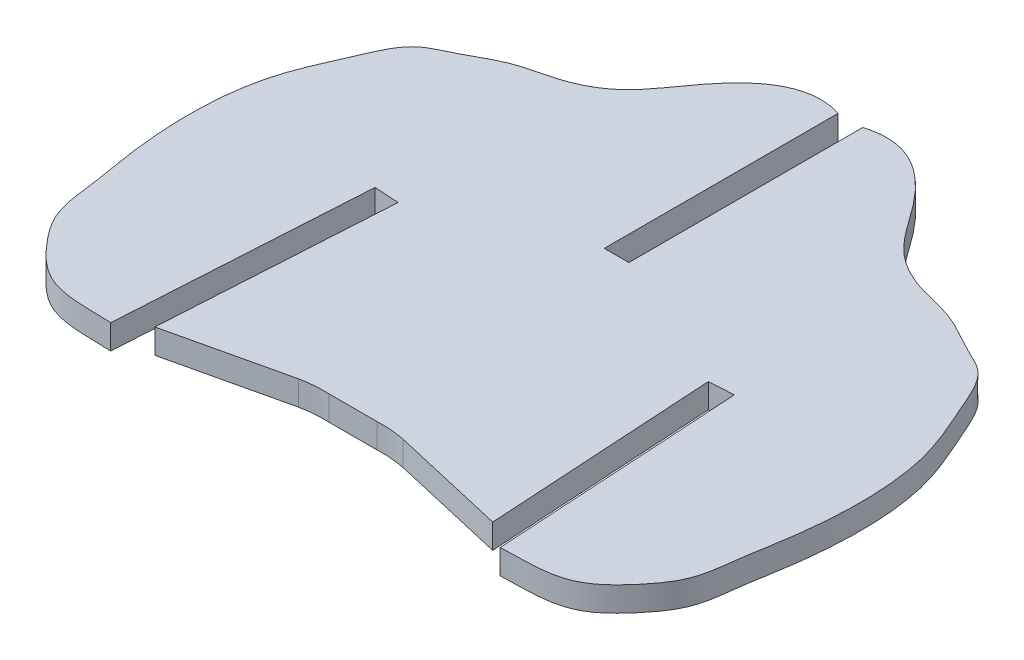
ISO-10303-21;
HEADER;
FILE_DESCRIPTION(('STEP AP214'),'2;1');
FILE_NAME('part.step','',(''),(''),'','','');
FILE_SCHEMA(('AUTOMOTIVE_DESIGN { 1 0 10303 214 1 1 1 1 }'));
ENDSEC;
DATA;
#1=APPLICATION_CONTEXT('core data for automotive mechanical design processes');
#2=APPLICATION_PROTOCOL_DEFINITION('international standard','automotive_design',2000,#1);
#3=PRODUCT_CONTEXT('',#1,'mechanical');
#4=PRODUCT('Part','Part','',(#3));
#5=PRODUCT_RELATED_PRODUCT_CATEGORY('part','',(#4));
#6=PRODUCT_DEFINITION_FORMATION('','',#4);
#7=PRODUCT_DEFINITION_CONTEXT('part definition',#1,'design');
#8=PRODUCT_DEFINITION('design','',#6,#7);
#9=PRODUCT_DEFINITION_SHAPE('','',#8);
#10=(LENGTH_UNIT() NAMED_UNIT(*) SI_UNIT(.MILLI.,.METRE.));
#11=(NAMED_UNIT(*) PLANE_ANGLE_UNIT() SI_UNIT($,.RADIAN.));
#12=(NAMED_UNIT(*) SI_UNIT($,.STERADIAN.) SOLID_ANGLE_UNIT());
#13=UNCERTAINTY_MEASURE_WITH_UNIT(LENGTH_MEASURE(1.E-05),#10,'distance_accuracy_value','');
#14=(GEOMETRIC_REPRESENTATION_CONTEXT(3) GLOBAL_UNCERTAINTY_ASSIGNED_CONTEXT((#13)) GLOBAL_UNIT_ASSIGNED_CONTEXT((#10,
#11,#12)) REPRESENTATION_CONTEXT('',''));
#15=CARTESIAN_POINT('',(0.,0.,0.));
#16=DIRECTION('',(0.,0.,1.));
#17=DIRECTION('',(1.,0.,0.));
#18=AXIS2_PLACEMENT_3D('',#15,#16,#17);
#19=CARTESIAN_POINT('',(322.506185163529,4.,-279.216996548922));
#20=CARTESIAN_POINT('',(315.784033325851,4.,-281.311766085583));
#21=CARTESIAN_POINT('',(308.229719217055,4.,-274.499419386254));
#22=CARTESIAN_POINT('',(302.327233956031,4.,-264.616389153382));
#23=CARTESIAN_POINT('',(295.405570696672,4.,-261.075530259062));
#24=CARTESIAN_POINT('',(288.57217539748,4.,-259.998183265288));
#25=CARTESIAN_POINT('',(283.597551311888,4.,-256.712650417958));
#26=CARTESIAN_POINT('',(277.74803247045,4.,-254.266266236053));
#27=CARTESIAN_POINT('',(274.862194463648,4.,-247.227227302913));
#28=CARTESIAN_POINT('',(270.865901955647,4.,-238.88630631199));
#29=CARTESIAN_POINT('',(269.340937728362,4.,-226.577719389289));
#30=CARTESIAN_POINT('',(270.315778530002,4.,-216.620970326966));
#31=CARTESIAN_POINT('',(271.95607082748,4.,-207.840217503691));
#32=CARTESIAN_POINT('',(272.304674706078,4.,-201.864992605412));
#33=CARTESIAN_POINT('',(276.509569600084,4.,-196.127844550806));
#34=CARTESIAN_POINT('',(281.140915827995,4.,-191.472787984609));
#35=CARTESIAN_POINT('',(287.393785872385,4.,-190.510159581782));
#36=CARTESIAN_POINT('',(291.147248056861,4.,-190.604513311933));
#37=CARTESIAN_POINT('',(292.815951682619,4.,-190.503683274104));
#38=B_SPLINE_CURVE_WITH_KNOTS('',3,(#19,#20,#21,#22,#23,#24,#25,#26,#27,#28,#29,#30,#31,#32,#33,
#34,#35,#36,#37),.UNSPECIFIED.,.F.,.F.,(4,1,1,1,1,1,1,1,1,1,1,1,1,1,1,1,4),(0.,0.13691507816526,
0.211026497905482,0.26049521129818,0.308388452991623,0.36733417055697,0.39572498038384,
0.44916700436731,0.529310598398589,0.610954998555693,0.727155915621704,0.756820743830885,
0.816073261631219,0.859025791607082,0.916880576523256,0.959528088785875,1.),.UNSPECIFIED.);
#39=DIRECTION('',(0.,-1.,0.));
#40=VECTOR('',#39,1.);
#41=SURFACE_OF_LINEAR_EXTRUSION('',#38,#40);
#42=CARTESIAN_POINT('',(322.506185163529,0.,-279.216996548922));
#43=CARTESIAN_POINT('',(315.784033325851,0.,-281.311766085583));
#44=CARTESIAN_POINT('',(308.229719217055,0.,-274.499419386254));
#45=CARTESIAN_POINT('',(302.327233956031,0.,-264.616389153382));
#46=CARTESIAN_POINT('',(295.405570696672,0.,-261.075530259062));
#47=CARTESIAN_POINT('',(288.57217539748,0.,-259.998183265288));
#48=CARTESIAN_POINT('',(283.597551311888,0.,-256.712650417958));
#49=CARTESIAN_POINT('',(277.74803247045,0.,-254.266266236053));
#50=CARTESIAN_POINT('',(274.862194463648,0.,-247.227227302913));
#51=CARTESIAN_POINT('',(270.865901955647,0.,-238.88630631199));
#52=CARTESIAN_POINT('',(269.340937728362,0.,-226.577719389289));
#53=CARTESIAN_POINT('',(270.315778530002,0.,-216.620970326966));
#54=CARTESIAN_POINT('',(271.95607082748,0.,-207.840217503691));
#55=CARTESIAN_POINT('',(272.304674706078,0.,-201.864992605412));
#56=CARTESIAN_POINT('',(276.509569600084,0.,-196.127844550806));
#57=CARTESIAN_POINT('',(281.140915827995,0.,-191.472787984609));
#58=CARTESIAN_POINT('',(287.393785872385,0.,-190.510159581782));
#59=CARTESIAN_POINT('',(291.147248056861,0.,-190.604513311933));
#60=CARTESIAN_POINT('',(292.815951682619,0.,-190.503683274104));
#61=B_SPLINE_CURVE_WITH_KNOTS('',3,(#42,#43,#44,#45,#46,#47,#48,#49,#50,#51,#52,#53,#54,#55,#56,
#57,#58,#59,#60),.UNSPECIFIED.,.F.,.F.,(4,1,1,1,1,1,1,1,1,1,1,1,1,1,1,1,4),(0.,0.13691507816526,
0.211026497905482,0.26049521129818,0.308388452991623,0.36733417055697,0.39572498038384,
0.44916700436731,0.529310598398589,0.610954998555693,0.727155915621704,0.756820743830885,
0.816073261631219,0.859025791607082,0.916880576523256,0.959528088785875,1.),.UNSPECIFIED.);
#62=CARTESIAN_POINT('',(322.506185163529,0.,-279.216996548922));
#63=VERTEX_POINT('',#62);
#64=CARTESIAN_POINT('',(292.815951682619,0.,-190.503683274104));
#65=VERTEX_POINT('',#64);
#66=EDGE_CURVE('E195',#63,#65,#61,.T.);
#67=ORIENTED_EDGE('',*,*,#66,.T.);
#68=DIRECTION('',(0.,-1.,0.));
#69=VECTOR('',#68,1.);
#70=CARTESIAN_POINT('',(292.815951682619,4.,-190.503683274104));
#71=LINE('',#70,#69);
#72=CARTESIAN_POINT('',(292.815951682619,4.,-190.503683274104));
#73=VERTEX_POINT('',#72);
#74=EDGE_CURVE('E11',#73,#65,#71,.T.);
#75=ORIENTED_EDGE('',*,*,#74,.F.);
#76=CARTESIAN_POINT('',(322.506185163529,4.,-279.216996548922));
#77=VERTEX_POINT('',#76);
#78=EDGE_CURVE('E284',#77,#73,#38,.T.);
#79=ORIENTED_EDGE('',*,*,#78,.F.);
#80=DIRECTION('',(0.,-1.,0.));
#81=VECTOR('',#80,1.);
#82=CARTESIAN_POINT('',(322.506185163529,4.,-279.216996548922));
#83=LINE('',#82,#81);
#84=EDGE_CURVE('E191',#77,#63,#83,.T.);
#85=ORIENTED_EDGE('',*,*,#84,.T.);
#86=EDGE_LOOP('',(#67,#75,#79,#85));
#87=FACE_BOUND('',#86,.T.);
#88=ADVANCED_FACE('F39',(#87),#41,.F.);
#89=CARTESIAN_POINT('',(292.815951682619,4.,-190.503683274104));
#90=DIRECTION('',(-0.998179443348504,0.,-0.0603141681238389));
#91=DIRECTION('',(-0.0603141681238389,0.,0.998179443348504));
#92=AXIS2_PLACEMENT_3D('',#89,#90,#91);
#93=PLANE('',#92);
#94=DIRECTION('',(0.0603141681238389,0.,-0.998179443348504));
#95=VECTOR('',#94,1.);
#96=CARTESIAN_POINT('',(292.815951682619,0.,-190.503683274104));
#97=LINE('',#96,#95);
#98=CARTESIAN_POINT('',(295.267574760643,0.,-231.077230675063));
#99=VERTEX_POINT('',#98);
#100=EDGE_CURVE('E201',#65,#99,#97,.T.);
#101=ORIENTED_EDGE('',*,*,#100,.T.);
#102=DIRECTION('',(0.,-1.,0.));
#103=VECTOR('',#102,1.);
#104=CARTESIAN_POINT('',(295.267574760643,4.,-231.077230675063));
#105=LINE('',#104,#103);
#106=CARTESIAN_POINT('',(295.267574760643,4.,-231.077230675063));
#107=VERTEX_POINT('',#106);
#108=EDGE_CURVE('E49',#107,#99,#105,.T.);
#109=ORIENTED_EDGE('',*,*,#108,.F.);
#110=DIRECTION('',(0.0603141681238389,0.,-0.998179443348504));
#111=VECTOR('',#110,1.);
#112=CARTESIAN_POINT('',(292.815951682619,4.,-190.503683274104));
#113=LINE('',#112,#111);
#114=EDGE_CURVE('E127',#73,#107,#113,.T.);
#115=ORIENTED_EDGE('',*,*,#114,.F.);
#116=ORIENTED_EDGE('',*,*,#74,.T.);
#117=EDGE_LOOP('',(#101,#109,#115,#116));
#118=FACE_BOUND('',#117,.T.);
#119=ADVANCED_FACE('F392',(#118),#93,.F.);
#120=CARTESIAN_POINT('',(295.267574760643,4.,-231.077230675063));
#121=DIRECTION('',(0.0603141681238404,0.,-0.998179443348504));
#122=DIRECTION('',(-0.998179443348504,0.,-0.0603141681238404));
#123=AXIS2_PLACEMENT_3D('',#120,#121,#122);
#124=PLANE('',#123);
#125=DIRECTION('',(0.998179443348504,0.,0.0603141681238404));
#126=VECTOR('',#125,1.);
#127=CARTESIAN_POINT('',(295.267574760643,0.,-231.077230675063));
#128=LINE('',#127,#126);
#129=CARTESIAN_POINT('',(299.260292534037,0.,-230.835974002568));
#130=VERTEX_POINT('',#129);
#131=EDGE_CURVE('E207',#99,#130,#128,.T.);
#132=ORIENTED_EDGE('',*,*,#131,.T.);
#133=DIRECTION('',(0.,-1.,0.));
#134=VECTOR('',#133,1.);
#135=CARTESIAN_POINT('',(299.260292534037,4.,-230.835974002568));
#136=LINE('',#135,#134);
#137=CARTESIAN_POINT('',(299.260292534037,4.,-230.835974002568));
#138=VERTEX_POINT('',#137);
#139=EDGE_CURVE('E327',#138,#130,#136,.T.);
#140=ORIENTED_EDGE('',*,*,#139,.F.);
#141=DIRECTION('',(0.998179443348504,0.,0.0603141681238404));
#142=VECTOR('',#141,1.);
#143=CARTESIAN_POINT('',(295.267574760643,4.,-231.077230675063));
#144=LINE('',#143,#142);
#145=EDGE_CURVE('E337',#107,#138,#144,.T.);
#146=ORIENTED_EDGE('',*,*,#145,.F.);
#147=ORIENTED_EDGE('',*,*,#108,.T.);
#148=EDGE_LOOP('',(#132,#140,#146,#147));
#149=FACE_BOUND('',#148,.T.);
#150=ADVANCED_FACE('F335',(#149),#124,.F.);
#151=CARTESIAN_POINT('',(299.260292534037,4.,-230.835974002568));
#152=DIRECTION('',(0.998179443348504,0.,0.0603141681238389));
#153=DIRECTION('',(0.0603141681238389,0.,-0.998179443348504));
#154=AXIS2_PLACEMENT_3D('',#151,#152,#153);
#155=PLANE('',#154);
#156=DIRECTION('',(-0.0603141681238389,0.,0.998179443348504));
#157=VECTOR('',#156,1.);
#158=CARTESIAN_POINT('',(299.260292534037,0.,-230.835974002568));
#159=LINE('',#158,#157);
#160=CARTESIAN_POINT('',(297.003479911162,0.,-193.48647490945));
#161=VERTEX_POINT('',#160);
#162=EDGE_CURVE('E210',#130,#161,#159,.T.);
#163=ORIENTED_EDGE('',*,*,#162,.T.);
#164=DIRECTION('',(0.,-1.,0.));
#165=VECTOR('',#164,1.);
#166=CARTESIAN_POINT('',(297.003479911162,4.,-193.48647490945));
#167=LINE('',#166,#165);
#168=CARTESIAN_POINT('',(297.003479911162,4.,-193.48647490945));
#169=VERTEX_POINT('',#168);
#170=EDGE_CURVE('E323',#169,#161,#167,.T.);
#171=ORIENTED_EDGE('',*,*,#170,.F.);
#172=DIRECTION('',(-0.0603141681238389,0.,0.998179443348504));
#173=VECTOR('',#172,1.);
#174=CARTESIAN_POINT('',(299.260292534037,4.,-230.835974002568));
#175=LINE('',#174,#173);
#176=EDGE_CURVE('E356',#138,#169,#175,.T.);
#177=ORIENTED_EDGE('',*,*,#176,.F.);
#178=ORIENTED_EDGE('',*,*,#139,.T.);
#179=EDGE_LOOP('',(#163,#171,#177,#178));
#180=FACE_BOUND('',#179,.T.);
#181=ADVANCED_FACE('F346',(#180),#155,.F.);
#182=CARTESIAN_POINT('',(297.003479911162,4.,-193.48647490945));
#183=DIRECTION('',(-0.224874405786858,0.,-0.974387757323545));
#184=DIRECTION('',(-0.974387757323545,0.,0.224874405786858));
#185=AXIS2_PLACEMENT_3D('',#182,#183,#184);
#186=PLANE('',#185);
#187=CARTESIAN_POINT('',(297.003479911162,0.,-193.48647490945));
#188=CARTESIAN_POINT('',(316.038590288234,0.,-197.879499250077));
#189=B_SPLINE_CURVE_WITH_KNOTS('',1,(#187,#188),.UNSPECIFIED.,.F.,.F.,(2,2),(0.,1.),.UNSPECIFIED.);
#190=CARTESIAN_POINT('',(316.038590288234,0.,-197.879499250077));
#191=VERTEX_POINT('',#190);
#192=EDGE_CURVE('E213',#161,#191,#189,.T.);
#193=ORIENTED_EDGE('',*,*,#192,.T.);
#194=DIRECTION('',(0.,-1.,0.));
#195=VECTOR('',#194,1.);
#196=CARTESIAN_POINT('',(316.038590288234,4.,-197.879499250077));
#197=LINE('',#196,#195);
#198=CARTESIAN_POINT('',(316.038590288234,4.,-197.879499250077));
#199=VERTEX_POINT('',#198);
#200=EDGE_CURVE('E319',#199,#191,#197,.T.);
#201=ORIENTED_EDGE('',*,*,#200,.F.);
#202=CARTESIAN_POINT('',(297.003479911162,4.,-193.48647490945));
#203=CARTESIAN_POINT('',(316.038590288234,4.,-197.879499250077));
#204=B_SPLINE_CURVE_WITH_KNOTS('',1,(#202,#203),.UNSPECIFIED.,.F.,.F.,(2,2),(0.,1.),.UNSPECIFIED.);
#205=EDGE_CURVE('E352',#169,#199,#204,.T.);
#206=ORIENTED_EDGE('',*,*,#205,.F.);
#207=ORIENTED_EDGE('',*,*,#170,.T.);
#208=EDGE_LOOP('',(#193,#201,#206,#207));
#209=FACE_BOUND('',#208,.T.);
#210=ADVANCED_FACE('F350',(#209),#186,.F.);
#211=CARTESIAN_POINT('',(316.038590288234,4.,-197.879499250077));
#212=CARTESIAN_POINT('',(318.288866716262,4.,-198.328988408155));
#213=CARTESIAN_POINT('',(320.571669046707,4.,-198.235143432406));
#214=B_SPLINE_CURVE_WITH_KNOTS('',2,(#211,#212,#213),.UNSPECIFIED.,.F.,.F.,(3,3),(0.,1.),.UNSPECIFIED.);
#215=DIRECTION('',(0.,-1.,0.));
#216=VECTOR('',#215,1.);
#217=SURFACE_OF_LINEAR_EXTRUSION('',#214,#216);
#218=CARTESIAN_POINT('',(316.038590288234,0.,-197.879499250077));
#219=CARTESIAN_POINT('',(318.288866716262,0.,-198.328988408155));
#220=CARTESIAN_POINT('',(320.571669046707,0.,-198.235143432406));
#221=B_SPLINE_CURVE_WITH_KNOTS('',2,(#218,#219,#220),.UNSPECIFIED.,.F.,.F.,(3,3),(0.,1.),.UNSPECIFIED.);
#222=CARTESIAN_POINT('',(320.571669046707,0.,-198.235143432406));
#223=VERTEX_POINT('',#222);
#224=EDGE_CURVE('E218',#191,#223,#221,.T.);
#225=ORIENTED_EDGE('',*,*,#224,.T.);
#226=DIRECTION('',(0.,-1.,0.));
#227=VECTOR('',#226,1.);
#228=CARTESIAN_POINT('',(320.571669046707,4.,-198.235143432406));
#229=LINE('',#228,#227);
#230=CARTESIAN_POINT('',(320.571669046707,4.,-198.235143432406));
#231=VERTEX_POINT('',#230);
#232=EDGE_CURVE('E315',#231,#223,#229,.T.);
#233=ORIENTED_EDGE('',*,*,#232,.F.);
#234=EDGE_CURVE('E355',#199,#231,#214,.T.);
#235=ORIENTED_EDGE('',*,*,#234,.F.);
#236=ORIENTED_EDGE('',*,*,#200,.T.);
#237=EDGE_LOOP('',(#225,#233,#235,#236));
#238=FACE_BOUND('',#237,.T.);
#239=ADVANCED_FACE('F380',(#238),#217,.F.);
#240=CARTESIAN_POINT('',(324.506185163528,4.,-198.235143432406));
#241=DIRECTION('',(0.,0.,-1.));
#242=DIRECTION('',(-1.,0.,0.));
#243=AXIS2_PLACEMENT_3D('',#240,#241,#242);
#244=PLANE('',#243);
#245=CARTESIAN_POINT('',(324.506185163528,0.,-198.235143432406));
#246=CARTESIAN_POINT('',(328.44070128035,0.,-198.235143432406));
#247=B_SPLINE_CURVE_WITH_KNOTS('',1,(#245,#246),.UNSPECIFIED.,.F.,.F.,(2,2),(0.,1.),.UNSPECIFIED.);
#248=CARTESIAN_POINT('',(324.506185163528,0.,-198.235143432406));
#249=VERTEX_POINT('',#248);
#250=CARTESIAN_POINT('',(328.44070128035,0.,-198.235143432406));
#251=VERTEX_POINT('',#250);
#252=EDGE_CURVE('E234',#249,#251,#247,.T.);
#253=ORIENTED_EDGE('',*,*,#252,.T.);
#254=DIRECTION('',(0.,-1.,0.));
#255=VECTOR('',#254,1.);
#256=CARTESIAN_POINT('',(328.44070128035,4.,-198.235143432406));
#257=LINE('',#256,#255);
#258=CARTESIAN_POINT('',(328.44070128035,4.,-198.235143432406));
#259=VERTEX_POINT('',#258);
#260=EDGE_CURVE('E311',#259,#251,#257,.T.);
#261=ORIENTED_EDGE('',*,*,#260,.F.);
#262=CARTESIAN_POINT('',(324.506185163528,4.,-198.235143432406));
#263=CARTESIAN_POINT('',(328.44070128035,4.,-198.235143432406));
#264=B_SPLINE_CURVE_WITH_KNOTS('',1,(#262,#263),.UNSPECIFIED.,.F.,.F.,(2,2),(0.,1.),.UNSPECIFIED.);
#265=CARTESIAN_POINT('',(324.506185163528,4.,-198.235143432406));
#266=VERTEX_POINT('',#265);
#267=EDGE_CURVE('E440',#266,#259,#264,.T.);
#268=ORIENTED_EDGE('',*,*,#267,.F.);
#269=CARTESIAN_POINT('',(320.571669046707,4.,-198.235143432406));
#270=CARTESIAN_POINT('',(324.506185163528,4.,-198.235143432406));
#271=B_SPLINE_CURVE_WITH_KNOTS('',1,(#269,#270),.UNSPECIFIED.,.F.,.F.,(2,2),(0.,1.),.UNSPECIFIED.);
#272=EDGE_CURVE('E360',#231,#266,#271,.T.);
#273=ORIENTED_EDGE('',*,*,#272,.F.);
#274=ORIENTED_EDGE('',*,*,#232,.T.);
#275=CARTESIAN_POINT('',(320.571669046707,0.,-198.235143432406));
#276=CARTESIAN_POINT('',(324.506185163528,0.,-198.235143432406));
#277=B_SPLINE_CURVE_WITH_KNOTS('',1,(#275,#276),.UNSPECIFIED.,.F.,.F.,(2,2),(0.,1.),.UNSPECIFIED.);
#278=EDGE_CURVE('E226',#223,#249,#277,.T.);
#279=ORIENTED_EDGE('',*,*,#278,.T.);
#280=EDGE_LOOP('',(#253,#261,#268,#273,#274,#279));
#281=FACE_BOUND('',#280,.T.);
#282=ADVANCED_FACE('F384',(#281),#244,.F.);
#283=CARTESIAN_POINT('',(328.44070128035,4.,-198.235143432406));
#284=CARTESIAN_POINT('',(330.723503610795,4.,-198.328988408155));
#285=CARTESIAN_POINT('',(332.973780038823,4.,-197.879499250077));
#286=B_SPLINE_CURVE_WITH_KNOTS('',2,(#283,#284,#285),.UNSPECIFIED.,.F.,.F.,(3,3),(0.,1.),.UNSPECIFIED.);
#287=DIRECTION('',(0.,-1.,0.));
#288=VECTOR('',#287,1.);
#289=SURFACE_OF_LINEAR_EXTRUSION('',#286,#288);
#290=CARTESIAN_POINT('',(328.44070128035,0.,-198.235143432406));
#291=CARTESIAN_POINT('',(330.723503610795,0.,-198.328988408155));
#292=CARTESIAN_POINT('',(332.973780038823,0.,-197.879499250077));
#293=B_SPLINE_CURVE_WITH_KNOTS('',2,(#290,#291,#292),.UNSPECIFIED.,.F.,.F.,(3,3),(0.,1.),.UNSPECIFIED.);
#294=CARTESIAN_POINT('',(332.973780038823,0.,-197.879499250077));
#295=VERTEX_POINT('',#294);
#296=EDGE_CURVE('E242',#251,#295,#293,.T.);
#297=ORIENTED_EDGE('',*,*,#296,.T.);
#298=DIRECTION('',(0.,-1.,0.));
#299=VECTOR('',#298,1.);
#300=CARTESIAN_POINT('',(332.973780038823,4.,-197.879499250077));
#301=LINE('',#300,#299);
#302=CARTESIAN_POINT('',(332.973780038823,4.,-197.879499250077));
#303=VERTEX_POINT('',#302);
#304=EDGE_CURVE('E307',#303,#295,#301,.T.);
#305=ORIENTED_EDGE('',*,*,#304,.F.);
#306=EDGE_CURVE('E432',#259,#303,#286,.T.);
#307=ORIENTED_EDGE('',*,*,#306,.F.);
#308=ORIENTED_EDGE('',*,*,#260,.T.);
#309=EDGE_LOOP('',(#297,#305,#307,#308));
#310=FACE_BOUND('',#309,.T.);
#311=ADVANCED_FACE('F431',(#310),#289,.F.);
#312=CARTESIAN_POINT('',(332.973780038823,4.,-197.879499250077));
#313=DIRECTION('',(0.224874405786858,0.,-0.974387757323545));
#314=DIRECTION('',(-0.974387757323545,0.,-0.224874405786858));
#315=AXIS2_PLACEMENT_3D('',#312,#313,#314);
#316=PLANE('',#315);
#317=CARTESIAN_POINT('',(332.973780038823,0.,-197.879499250077));
#318=CARTESIAN_POINT('',(352.008890415895,0.,-193.48647490945));
#319=B_SPLINE_CURVE_WITH_KNOTS('',1,(#317,#318),.UNSPECIFIED.,.F.,.F.,(2,2),(0.,1.),.UNSPECIFIED.);
#320=CARTESIAN_POINT('',(352.008890415895,0.,-193.48647490945));
#321=VERTEX_POINT('',#320);
#322=EDGE_CURVE('E250',#295,#321,#319,.T.);
#323=ORIENTED_EDGE('',*,*,#322,.T.);
#324=DIRECTION('',(0.,-1.,0.));
#325=VECTOR('',#324,1.);
#326=CARTESIAN_POINT('',(352.008890415895,4.,-193.48647490945));
#327=LINE('',#326,#325);
#328=CARTESIAN_POINT('',(352.008890415895,4.,-193.48647490945));
#329=VERTEX_POINT('',#328);
#330=EDGE_CURVE('E303',#329,#321,#327,.T.);
#331=ORIENTED_EDGE('',*,*,#330,.F.);
#332=CARTESIAN_POINT('',(332.973780038823,4.,-197.879499250077));
#333=CARTESIAN_POINT('',(352.008890415895,4.,-193.48647490945));
#334=B_SPLINE_CURVE_WITH_KNOTS('',1,(#332,#333),.UNSPECIFIED.,.F.,.F.,(2,2),(0.,1.),.UNSPECIFIED.);
#335=EDGE_CURVE('E427',#303,#329,#334,.T.);
#336=ORIENTED_EDGE('',*,*,#335,.F.);
#337=ORIENTED_EDGE('',*,*,#304,.T.);
#338=EDGE_LOOP('',(#323,#331,#336,#337));
#339=FACE_BOUND('',#338,.T.);
#340=ADVANCED_FACE('F426',(#339),#316,.F.);
#341=CARTESIAN_POINT('',(349.75207779302,4.,-230.835974002568));
#342=DIRECTION('',(-0.998179443348504,0.,0.0603141681238389));
#343=DIRECTION('',(0.0603141681238389,0.,0.998179443348504));
#344=AXIS2_PLACEMENT_3D('',#341,#342,#343);
#345=PLANE('',#344);
#346=DIRECTION('',(-0.0603141681238389,0.,-0.998179443348504));
#347=VECTOR('',#346,1.);
#348=CARTESIAN_POINT('',(349.75207779302,0.,-230.835974002568));
#349=LINE('',#348,#347);
#350=CARTESIAN_POINT('',(349.75207779302,0.,-230.835974002568));
#351=VERTEX_POINT('',#350);
#352=EDGE_CURVE('E258',#321,#351,#349,.T.);
#353=ORIENTED_EDGE('',*,*,#352,.T.);
#354=DIRECTION('',(0.,-1.,0.));
#355=VECTOR('',#354,1.);
#356=CARTESIAN_POINT('',(349.75207779302,4.,-230.835974002568));
#357=LINE('',#356,#355);
#358=CARTESIAN_POINT('',(349.75207779302,4.,-230.835974002568));
#359=VERTEX_POINT('',#358);
#360=EDGE_CURVE('E299',#359,#351,#357,.T.);
#361=ORIENTED_EDGE('',*,*,#360,.F.);
#362=DIRECTION('',(-0.0603141681238389,0.,-0.998179443348504));
#363=VECTOR('',#362,1.);
#364=CARTESIAN_POINT('',(349.75207779302,4.,-230.835974002568));
#365=LINE('',#364,#363);
#366=EDGE_CURVE('E423',#329,#359,#365,.T.);
#367=ORIENTED_EDGE('',*,*,#366,.F.);
#368=ORIENTED_EDGE('',*,*,#330,.T.);
#369=EDGE_LOOP('',(#353,#361,#367,#368));
#370=FACE_BOUND('',#369,.T.);
#371=ADVANCED_FACE('F420',(#370),#345,.F.);
#372=CARTESIAN_POINT('',(353.744795566414,4.,-231.077230675063));
#373=DIRECTION('',(-0.0603141681238404,0.,-0.998179443348504));
#374=DIRECTION('',(-0.998179443348504,0.,0.0603141681238404));
#375=AXIS2_PLACEMENT_3D('',#372,#373,#374);
#376=PLANE('',#375);
#377=DIRECTION('',(0.998179443348504,0.,-0.0603141681238404));
#378=VECTOR('',#377,1.);
#379=CARTESIAN_POINT('',(353.744795566414,0.,-231.077230675063));
#380=LINE('',#379,#378);
#381=CARTESIAN_POINT('',(353.744795566414,0.,-231.077230675063));
#382=VERTEX_POINT('',#381);
#383=EDGE_CURVE('E264',#351,#382,#380,.T.);
#384=ORIENTED_EDGE('',*,*,#383,.T.);
#385=DIRECTION('',(0.,-1.,0.));
#386=VECTOR('',#385,1.);
#387=CARTESIAN_POINT('',(353.744795566414,4.,-231.077230675063));
#388=LINE('',#387,#386);
#389=CARTESIAN_POINT('',(353.744795566414,4.,-231.077230675063));
#390=VERTEX_POINT('',#389);
#391=EDGE_CURVE('E295',#390,#382,#388,.T.);
#392=ORIENTED_EDGE('',*,*,#391,.F.);
#393=DIRECTION('',(0.998179443348504,0.,-0.0603141681238404));
#394=VECTOR('',#393,1.);
#395=CARTESIAN_POINT('',(353.744795566414,4.,-231.077230675063));
#396=LINE('',#395,#394);
#397=EDGE_CURVE('E414',#359,#390,#396,.T.);
#398=ORIENTED_EDGE('',*,*,#397,.F.);
#399=ORIENTED_EDGE('',*,*,#360,.T.);
#400=EDGE_LOOP('',(#384,#392,#398,#399));
#401=FACE_BOUND('',#400,.T.);
#402=ADVANCED_FACE('F413',(#401),#376,.F.);
#403=CARTESIAN_POINT('',(356.196418644438,4.,-190.503683274104));
#404=DIRECTION('',(0.998179443348504,0.,-0.0603141681238389));
#405=DIRECTION('',(-0.0603141681238389,0.,-0.998179443348504));
#406=AXIS2_PLACEMENT_3D('',#403,#404,#405);
#407=PLANE('',#406);
#408=DIRECTION('',(0.0603141681238389,0.,0.998179443348504));
#409=VECTOR('',#408,1.);
#410=CARTESIAN_POINT('',(356.196418644438,0.,-190.503683274104));
#411=LINE('',#410,#409);
#412=CARTESIAN_POINT('',(356.196418644438,0.,-190.503683274104));
#413=VERTEX_POINT('',#412);
#414=EDGE_CURVE('E267',#382,#413,#411,.T.);
#415=ORIENTED_EDGE('',*,*,#414,.T.);
#416=DIRECTION('',(0.,-1.,0.));
#417=VECTOR('',#416,1.);
#418=CARTESIAN_POINT('',(356.196418644438,4.,-190.503683274104));
#419=LINE('',#418,#417);
#420=CARTESIAN_POINT('',(356.196418644438,4.,-190.503683274104));
#421=VERTEX_POINT('',#420);
#422=EDGE_CURVE('E291',#421,#413,#419,.T.);
#423=ORIENTED_EDGE('',*,*,#422,.F.);
#424=DIRECTION('',(0.0603141681238389,0.,0.998179443348504));
#425=VECTOR('',#424,1.);
#426=CARTESIAN_POINT('',(356.196418644438,4.,-190.503683274104));
#427=LINE('',#426,#425);
#428=EDGE_CURVE('E409',#390,#421,#427,.T.);
#429=ORIENTED_EDGE('',*,*,#428,.F.);
#430=ORIENTED_EDGE('',*,*,#391,.T.);
#431=EDGE_LOOP('',(#415,#423,#429,#430));
#432=FACE_BOUND('',#431,.T.);
#433=ADVANCED_FACE('F408',(#432),#407,.F.);
#434=CARTESIAN_POINT('',(356.196418644438,4.,-190.503683274104));
#435=CARTESIAN_POINT('',(357.865122270196,4.,-190.604513311933));
#436=CARTESIAN_POINT('',(361.618584454671,4.,-190.510159581782));
#437=CARTESIAN_POINT('',(367.871454499062,4.,-191.472787984609));
#438=CARTESIAN_POINT('',(372.502800726973,4.,-196.127844550806));
#439=CARTESIAN_POINT('',(376.707695620979,4.,-201.864992605412));
#440=CARTESIAN_POINT('',(377.056299499577,4.,-207.840217503691));
#441=CARTESIAN_POINT('',(378.696591797055,4.,-216.620970326966));
#442=CARTESIAN_POINT('',(379.671432598695,4.,-226.577719389289));
#443=CARTESIAN_POINT('',(378.14646837141,4.,-238.88630631199));
#444=CARTESIAN_POINT('',(374.150175863409,4.,-247.227227302913));
#445=CARTESIAN_POINT('',(371.264337856607,4.,-254.266266236053));
#446=CARTESIAN_POINT('',(365.414819015168,4.,-256.712650417958));
#447=CARTESIAN_POINT('',(360.440194929577,4.,-259.998183265288));
#448=CARTESIAN_POINT('',(353.606799630385,4.,-261.075530259062));
#449=CARTESIAN_POINT('',(346.685136371026,4.,-264.616389153382));
#450=CARTESIAN_POINT('',(340.782651110002,4.,-274.499419386254));
#451=CARTESIAN_POINT('',(333.228337001206,4.,-281.311766085583));
#452=CARTESIAN_POINT('',(326.506185163528,4.,-279.216996548922));
#453=B_SPLINE_CURVE_WITH_KNOTS('',3,(#434,#435,#436,#437,#438,#439,#440,#441,#442,#443,#444,
#445,#446,#447,#448,#449,#450,#451,#452),.UNSPECIFIED.,.F.,.F.,(4,1,1,1,1,1,1,1,1,1,1,1,1,1,1,1,
4),(0.,0.0404719112141247,0.0831194234767441,0.140974208392918,0.183926738368781,
0.243179256169115,0.272844084378296,0.389045001444307,0.470689401601411,0.55083299563269,
0.60427501961616,0.63266582944303,0.691611547008377,0.73950478870182,0.788973502094518,
0.86308492183474,1.),.UNSPECIFIED.);
#454=DIRECTION('',(0.,-1.,0.));
#455=VECTOR('',#454,1.);
#456=SURFACE_OF_LINEAR_EXTRUSION('',#453,#455);
#457=CARTESIAN_POINT('',(356.196418644438,0.,-190.503683274104));
#458=CARTESIAN_POINT('',(357.865122270196,0.,-190.604513311933));
#459=CARTESIAN_POINT('',(361.618584454671,0.,-190.510159581782));
#460=CARTESIAN_POINT('',(367.871454499062,0.,-191.472787984609));
#461=CARTESIAN_POINT('',(372.502800726973,0.,-196.127844550806));
#462=CARTESIAN_POINT('',(376.707695620979,0.,-201.864992605412));
#463=CARTESIAN_POINT('',(377.056299499577,0.,-207.840217503691));
#464=CARTESIAN_POINT('',(378.696591797055,0.,-216.620970326966));
#465=CARTESIAN_POINT('',(379.671432598695,0.,-226.577719389289));
#466=CARTESIAN_POINT('',(378.14646837141,0.,-238.88630631199));
#467=CARTESIAN_POINT('',(374.150175863409,0.,-247.227227302913));
#468=CARTESIAN_POINT('',(371.264337856607,0.,-254.266266236053));
#469=CARTESIAN_POINT('',(365.414819015168,0.,-256.712650417958));
#470=CARTESIAN_POINT('',(360.440194929577,0.,-259.998183265288));
#471=CARTESIAN_POINT('',(353.606799630385,0.,-261.075530259062));
#472=CARTESIAN_POINT('',(346.685136371026,0.,-264.616389153382));
#473=CARTESIAN_POINT('',(340.782651110002,0.,-274.499419386254));
#474=CARTESIAN_POINT('',(333.228337001206,0.,-281.311766085583));
#475=CARTESIAN_POINT('',(326.506185163528,0.,-279.216996548922));
#476=B_SPLINE_CURVE_WITH_KNOTS('',3,(#457,#458,#459,#460,#461,#462,#463,#464,#465,#466,#467,
#468,#469,#470,#471,#472,#473,#474,#475),.UNSPECIFIED.,.F.,.F.,(4,1,1,1,1,1,1,1,1,1,1,1,1,1,1,1,
4),(0.,0.0404719112141247,0.0831194234767441,0.140974208392918,0.183926738368781,
0.243179256169115,0.272844084378296,0.389045001444307,0.470689401601411,0.55083299563269,
0.60427501961616,0.63266582944303,0.691611547008377,0.73950478870182,0.788973502094518,
0.86308492183474,1.),.UNSPECIFIED.);
#477=CARTESIAN_POINT('',(326.506185163528,0.,-279.216996548922));
#478=VERTEX_POINT('',#477);
#479=EDGE_CURVE('E270',#413,#478,#476,.T.);
#480=ORIENTED_EDGE('',*,*,#479,.T.);
#481=DIRECTION('',(0.,-1.,0.));
#482=VECTOR('',#481,1.);
#483=CARTESIAN_POINT('',(326.506185163528,4.,-279.216996548922));
#484=LINE('',#483,#482);
#485=CARTESIAN_POINT('',(326.506185163528,4.,-279.216996548922));
#486=VERTEX_POINT('',#485);
#487=EDGE_CURVE('E184',#486,#478,#484,.T.);
#488=ORIENTED_EDGE('',*,*,#487,.F.);
#489=EDGE_CURVE('E173',#421,#486,#453,.T.);
#490=ORIENTED_EDGE('',*,*,#489,.F.);
#491=ORIENTED_EDGE('',*,*,#422,.T.);
#492=EDGE_LOOP('',(#480,#488,#490,#491));
#493=FACE_BOUND('',#492,.T.);
#494=ADVANCED_FACE('F404',(#493),#456,.F.);
#495=CARTESIAN_POINT('',(326.506185163528,4.,-279.216996548922));
#496=DIRECTION('',(1.,0.,0.));
#497=DIRECTION('',(0.,0.,-1.));
#498=AXIS2_PLACEMENT_3D('',#495,#496,#497);
#499=PLANE('',#498);
#500=DIRECTION('',(0.,0.,1.));
#501=VECTOR('',#500,1.);
#502=CARTESIAN_POINT('',(326.506185163528,0.,-279.216996548922));
#503=LINE('',#502,#501);
#504=CARTESIAN_POINT('',(326.506185163529,0.,-241.14827910328));
#505=VERTEX_POINT('',#504);
#506=EDGE_CURVE('E182',#478,#505,#503,.T.);
#507=ORIENTED_EDGE('',*,*,#506,.T.);
#508=DIRECTION('',(0.,-1.,0.));
#509=VECTOR('',#508,1.);
#510=CARTESIAN_POINT('',(326.506185163529,4.,-241.14827910328));
#511=LINE('',#510,#509);
#512=CARTESIAN_POINT('',(326.506185163529,4.,-241.14827910328));
#513=VERTEX_POINT('',#512);
#514=EDGE_CURVE('E179',#513,#505,#511,.T.);
#515=ORIENTED_EDGE('',*,*,#514,.F.);
#516=DIRECTION('',(0.,0.,1.));
#517=VECTOR('',#516,1.);
#518=CARTESIAN_POINT('',(326.506185163528,4.,-279.216996548922));
#519=LINE('',#518,#517);
#520=EDGE_CURVE('E167',#486,#513,#519,.T.);
#521=ORIENTED_EDGE('',*,*,#520,.F.);
#522=ORIENTED_EDGE('',*,*,#487,.T.);
#523=EDGE_LOOP('',(#507,#515,#521,#522));
#524=FACE_BOUND('',#523,.T.);
#525=ADVANCED_FACE('F180',(#524),#499,.F.);
#526=CARTESIAN_POINT('',(322.506185163528,4.,-241.14827910328));
#527=DIRECTION('',(0.,0.,1.));
#528=DIRECTION('',(1.,0.,0.));
#529=AXIS2_PLACEMENT_3D('',#526,#527,#528);
#530=PLANE('',#529);
#531=DIRECTION('',(-1.,0.,0.));
#532=VECTOR('',#531,1.);
#533=CARTESIAN_POINT('',(322.506185163528,0.,-241.14827910328));
#534=LINE('',#533,#532);
#535=CARTESIAN_POINT('',(322.506185163528,0.,-241.14827910328));
#536=VERTEX_POINT('',#535);
#537=EDGE_CURVE('E113',#505,#536,#534,.T.);
#538=ORIENTED_EDGE('',*,*,#537,.T.);
#539=DIRECTION('',(0.,-1.,0.));
#540=VECTOR('',#539,1.);
#541=CARTESIAN_POINT('',(322.506185163528,4.,-241.14827910328));
#542=LINE('',#541,#540);
#543=CARTESIAN_POINT('',(322.506185163528,4.,-241.14827910328));
#544=VERTEX_POINT('',#543);
#545=EDGE_CURVE('E185',#544,#536,#542,.T.);
#546=ORIENTED_EDGE('',*,*,#545,.F.);
#547=DIRECTION('',(-1.,0.,0.));
#548=VECTOR('',#547,1.);
#549=CARTESIAN_POINT('',(322.506185163528,4.,-241.14827910328));
#550=LINE('',#549,#548);
#551=EDGE_CURVE('E171',#513,#544,#550,.T.);
#552=ORIENTED_EDGE('',*,*,#551,.F.);
#553=ORIENTED_EDGE('',*,*,#514,.T.);
#554=EDGE_LOOP('',(#538,#546,#552,#553));
#555=FACE_BOUND('',#554,.T.);
#556=ADVANCED_FACE('F187',(#555),#530,.F.);
#557=CARTESIAN_POINT('',(322.506185163529,4.,-279.216996548922));
#558=DIRECTION('',(-1.,0.,0.));
#559=DIRECTION('',(0.,0.,1.));
#560=AXIS2_PLACEMENT_3D('',#557,#558,#559);
#561=PLANE('',#560);
#562=DIRECTION('',(0.,0.,-1.));
#563=VECTOR('',#562,1.);
#564=CARTESIAN_POINT('',(322.506185163529,0.,-279.216996548922));
#565=LINE('',#564,#563);
#566=EDGE_CURVE('E119',#536,#63,#565,.T.);
#567=ORIENTED_EDGE('',*,*,#566,.T.);
#568=ORIENTED_EDGE('',*,*,#84,.F.);
#569=DIRECTION('',(0.,0.,-1.));
#570=VECTOR('',#569,1.);
#571=CARTESIAN_POINT('',(322.506185163529,4.,-279.216996548922));
#572=LINE('',#571,#570);
#573=EDGE_CURVE('E57',#544,#77,#572,.T.);
#574=ORIENTED_EDGE('',*,*,#573,.F.);
#575=ORIENTED_EDGE('',*,*,#545,.T.);
#576=EDGE_LOOP('',(#567,#568,#574,#575));
#577=FACE_BOUND('',#576,.T.);
#578=ADVANCED_FACE('F489',(#577),#561,.F.);
#579=CARTESIAN_POINT('',(272.657201758037,4.,-242.307240625036));
#580=DIRECTION('',(0.,-1.,0.));
#581=DIRECTION('',(0.,0.,-1.));
#582=AXIS2_PLACEMENT_3D('',#579,#580,#581);
#583=PLANE('',#582);
#584=ORIENTED_EDGE('',*,*,#78,.T.);
#585=ORIENTED_EDGE('',*,*,#114,.T.);
#586=ORIENTED_EDGE('',*,*,#145,.T.);
#587=ORIENTED_EDGE('',*,*,#176,.T.);
#588=ORIENTED_EDGE('',*,*,#205,.T.);
#589=ORIENTED_EDGE('',*,*,#234,.T.);
#590=ORIENTED_EDGE('',*,*,#272,.T.);
#591=ORIENTED_EDGE('',*,*,#267,.T.);
#592=ORIENTED_EDGE('',*,*,#306,.T.);
#593=ORIENTED_EDGE('',*,*,#335,.T.);
#594=ORIENTED_EDGE('',*,*,#366,.T.);
#595=ORIENTED_EDGE('',*,*,#397,.T.);
#596=ORIENTED_EDGE('',*,*,#428,.T.);
#597=ORIENTED_EDGE('',*,*,#489,.T.);
#598=ORIENTED_EDGE('',*,*,#520,.T.);
#599=ORIENTED_EDGE('',*,*,#551,.T.);
#600=ORIENTED_EDGE('',*,*,#573,.T.);
#601=EDGE_LOOP('',(#584,#585,#586,#587,#588,#589,#590,#591,#592,#593,#594,#595,#596,#597,#598,
#599,#600));
#602=FACE_BOUND('',#601,.T.);
#603=ADVANCED_FACE('F169',(#602),#583,.F.);
#604=CARTESIAN_POINT('',(272.657201758037,0.,-242.307240625036));
#605=DIRECTION('',(0.,-1.,0.));
#606=DIRECTION('',(0.,0.,-1.));
#607=AXIS2_PLACEMENT_3D('',#604,#605,#606);
#608=PLANE('',#607);
#609=ORIENTED_EDGE('',*,*,#66,.F.);
#610=ORIENTED_EDGE('',*,*,#566,.F.);
#611=ORIENTED_EDGE('',*,*,#537,.F.);
#612=ORIENTED_EDGE('',*,*,#506,.F.);
#613=ORIENTED_EDGE('',*,*,#479,.F.);
#614=ORIENTED_EDGE('',*,*,#414,.F.);
#615=ORIENTED_EDGE('',*,*,#383,.F.);
#616=ORIENTED_EDGE('',*,*,#352,.F.);
#617=ORIENTED_EDGE('',*,*,#322,.F.);
#618=ORIENTED_EDGE('',*,*,#296,.F.);
#619=ORIENTED_EDGE('',*,*,#252,.F.);
#620=ORIENTED_EDGE('',*,*,#278,.F.);
#621=ORIENTED_EDGE('',*,*,#224,.F.);
#622=ORIENTED_EDGE('',*,*,#192,.F.);
#623=ORIENTED_EDGE('',*,*,#162,.F.);
#624=ORIENTED_EDGE('',*,*,#131,.F.);
#625=ORIENTED_EDGE('',*,*,#100,.F.);
#626=EDGE_LOOP('',(#609,#610,#611,#612,#613,#614,#615,#616,#617,#618,#619,#620,#621,#622,#623,
#624,#625));
#627=FACE_BOUND('',#626,.T.);
#628=ADVANCED_FACE('F341',(#627),#608,.T.);
#629=CLOSED_SHELL('',(#88,#119,#150,#181,#210,#239,#282,#311,#340,#371,#402,#433,#494,#525,#556,
#578,#603,#628));
#630=MANIFOLD_SOLID_BREP('B2',#629);
#631=ADVANCED_BREP_SHAPE_REPRESENTATION('',(#18,#630),#14);
#632=SHAPE_DEFINITION_REPRESENTATION(#9,#631);
ENDSEC;
END-ISO-10303-21;
